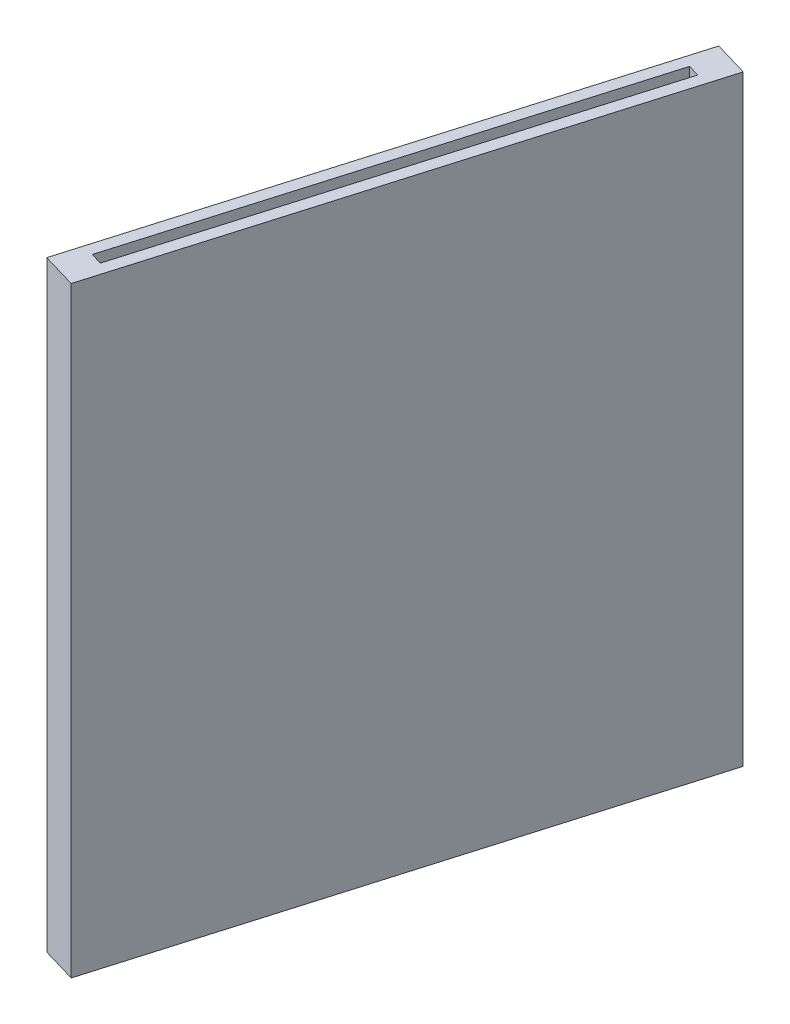
ISO-10303-21;
HEADER;
FILE_DESCRIPTION(('STEP AP214'),'2;1');
FILE_NAME('part.step','',(''),(''),'','','');
FILE_SCHEMA(('AUTOMOTIVE_DESIGN { 1 0 10303 214 1 1 1 1 }'));
ENDSEC;
DATA;
#1=APPLICATION_CONTEXT('core data for automotive mechanical design processes');
#2=APPLICATION_PROTOCOL_DEFINITION('international standard','automotive_design',2000,#1);
#3=PRODUCT_CONTEXT('',#1,'mechanical');
#4=PRODUCT('Part','Part','',(#3));
#5=PRODUCT_RELATED_PRODUCT_CATEGORY('part','',(#4));
#6=PRODUCT_DEFINITION_FORMATION('','',#4);
#7=PRODUCT_DEFINITION_CONTEXT('part definition',#1,'design');
#8=PRODUCT_DEFINITION('design','',#6,#7);
#9=PRODUCT_DEFINITION_SHAPE('','',#8);
#10=(LENGTH_UNIT() NAMED_UNIT(*) SI_UNIT(.MILLI.,.METRE.));
#11=(NAMED_UNIT(*) PLANE_ANGLE_UNIT() SI_UNIT($,.RADIAN.));
#12=(NAMED_UNIT(*) SI_UNIT($,.STERADIAN.) SOLID_ANGLE_UNIT());
#13=UNCERTAINTY_MEASURE_WITH_UNIT(LENGTH_MEASURE(1.E-05),#10,'distance_accuracy_value','');
#14=(GEOMETRIC_REPRESENTATION_CONTEXT(3) GLOBAL_UNCERTAINTY_ASSIGNED_CONTEXT((#13)) GLOBAL_UNIT_ASSIGNED_CONTEXT((#10,
#11,#12)) REPRESENTATION_CONTEXT('',''));
#15=CARTESIAN_POINT('',(0.,0.,0.));
#16=DIRECTION('',(0.,0.,1.));
#17=DIRECTION('',(1.,0.,0.));
#18=AXIS2_PLACEMENT_3D('',#15,#16,#17);
#19=CARTESIAN_POINT('',(-3.6551825609865,-127.,-1.07505369440774));
#20=DIRECTION('',(-0.959365501571275,0.,-0.282166323991537));
#21=DIRECTION('',(-0.282166323991537,0.,0.959365501571275));
#22=AXIS2_PLACEMENT_3D('',#19,#20,#21);
#23=PLANE('',#22);
#24=DIRECTION('',(-0.282166323991537,0.,0.959365501571275));
#25=VECTOR('',#24,1.);
#26=CARTESIAN_POINT('',(-3.6551825609865,0.,-1.07505369440774));
#27=LINE('',#26,#25);
#28=CARTESIAN_POINT('',(-3.6551825609865,0.,-1.07505369440774));
#29=VERTEX_POINT('',#28);
#30=CARTESIAN_POINT('',(-35.9067933932191,0.,108.580423135189));
#31=VERTEX_POINT('',#30);
#32=EDGE_CURVE('E154',#29,#31,#27,.T.);
#33=ORIENTED_EDGE('',*,*,#32,.F.);
#34=DIRECTION('',(0.,1.,0.));
#35=VECTOR('',#34,1.);
#36=CARTESIAN_POINT('',(-3.6551825609865,-127.,-1.07505369440774));
#37=LINE('',#36,#35);
#38=CARTESIAN_POINT('',(-3.6551825609865,-127.,-1.07505369440774));
#39=VERTEX_POINT('',#38);
#40=EDGE_CURVE('E11',#39,#29,#37,.T.);
#41=ORIENTED_EDGE('',*,*,#40,.F.);
#42=DIRECTION('',(-0.282166323991537,0.,0.959365501571275));
#43=VECTOR('',#42,1.);
#44=CARTESIAN_POINT('',(-3.6551825609865,-127.,-1.07505369440774));
#45=LINE('',#44,#43);
#46=CARTESIAN_POINT('',(-35.9067933932191,-127.,108.580423135189));
#47=VERTEX_POINT('',#46);
#48=EDGE_CURVE('E160',#39,#47,#45,.T.);
#49=ORIENTED_EDGE('',*,*,#48,.T.);
#50=DIRECTION('',(0.,1.,0.));
#51=VECTOR('',#50,1.);
#52=CARTESIAN_POINT('',(-35.9067933932191,-127.,108.580423135189));
#53=LINE('',#52,#51);
#54=EDGE_CURVE('E48',#47,#31,#53,.T.);
#55=ORIENTED_EDGE('',*,*,#54,.T.);
#56=EDGE_LOOP('',(#33,#41,#49,#55));
#57=FACE_BOUND('',#56,.T.);
#58=ADVANCED_FACE('F45',(#57),#23,.T.);
#59=CARTESIAN_POINT('',(3.6551825609865,-127.,1.07505369440774));
#60=DIRECTION('',(0.282166323991536,0.,-0.959365501571275));
#61=DIRECTION('',(-0.959365501571275,0.,-0.282166323991536));
#62=AXIS2_PLACEMENT_3D('',#59,#60,#61);
#63=PLANE('',#62);
#64=DIRECTION('',(-0.959365501571275,0.,-0.282166323991536));
#65=VECTOR('',#64,1.);
#66=CARTESIAN_POINT('',(3.6551825609865,0.,1.07505369440774));
#67=LINE('',#66,#65);
#68=CARTESIAN_POINT('',(3.6551825609865,0.,1.07505369440774));
#69=VERTEX_POINT('',#68);
#70=EDGE_CURVE('E165',#69,#29,#67,.T.);
#71=ORIENTED_EDGE('',*,*,#70,.F.);
#72=DIRECTION('',(0.,1.,0.));
#73=VECTOR('',#72,1.);
#74=CARTESIAN_POINT('',(3.6551825609865,-127.,1.07505369440774));
#75=LINE('',#74,#73);
#76=CARTESIAN_POINT('',(3.6551825609865,-127.,1.07505369440774));
#77=VERTEX_POINT('',#76);
#78=EDGE_CURVE('E54',#77,#69,#75,.T.);
#79=ORIENTED_EDGE('',*,*,#78,.F.);
#80=DIRECTION('',(-0.959365501571275,0.,-0.282166323991536));
#81=VECTOR('',#80,1.);
#82=CARTESIAN_POINT('',(3.6551825609865,-127.,1.07505369440774));
#83=LINE('',#82,#81);
#84=EDGE_CURVE('E173',#77,#39,#83,.T.);
#85=ORIENTED_EDGE('',*,*,#84,.T.);
#86=ORIENTED_EDGE('',*,*,#40,.T.);
#87=EDGE_LOOP('',(#71,#79,#85,#86));
#88=FACE_BOUND('',#87,.T.);
#89=ADVANCED_FACE('F207',(#88),#63,.T.);
#90=CARTESIAN_POINT('',(-28.596428271246,-127.,110.730530524004));
#91=DIRECTION('',(0.959365501571275,0.,0.282166323991535));
#92=DIRECTION('',(0.282166323991535,0.,-0.959365501571275));
#93=AXIS2_PLACEMENT_3D('',#90,#91,#92);
#94=PLANE('',#93);
#95=DIRECTION('',(0.282166323991535,0.,-0.959365501571275));
#96=VECTOR('',#95,1.);
#97=CARTESIAN_POINT('',(-28.596428271246,0.,110.730530524004));
#98=LINE('',#97,#96);
#99=CARTESIAN_POINT('',(-28.596428271246,0.,110.730530524004));
#100=VERTEX_POINT('',#99);
#101=EDGE_CURVE('E184',#100,#69,#98,.T.);
#102=ORIENTED_EDGE('',*,*,#101,.F.);
#103=DIRECTION('',(0.,1.,0.));
#104=VECTOR('',#103,1.);
#105=CARTESIAN_POINT('',(-28.596428271246,-127.,110.730530524004));
#106=LINE('',#105,#104);
#107=CARTESIAN_POINT('',(-28.596428271246,-127.,110.730530524004));
#108=VERTEX_POINT('',#107);
#109=EDGE_CURVE('E192',#108,#100,#106,.T.);
#110=ORIENTED_EDGE('',*,*,#109,.F.);
#111=DIRECTION('',(0.282166323991535,0.,-0.959365501571275));
#112=VECTOR('',#111,1.);
#113=CARTESIAN_POINT('',(-28.596428271246,-127.,110.730530524004));
#114=LINE('',#113,#112);
#115=EDGE_CURVE('E169',#108,#77,#114,.T.);
#116=ORIENTED_EDGE('',*,*,#115,.T.);
#117=ORIENTED_EDGE('',*,*,#78,.T.);
#118=EDGE_LOOP('',(#102,#110,#116,#117));
#119=FACE_BOUND('',#118,.T.);
#120=ADVANCED_FACE('F211',(#119),#94,.T.);
#121=CARTESIAN_POINT('',(-35.9067933932191,-127.,108.580423135189));
#122=DIRECTION('',(-0.282166323991537,0.,0.959365501571275));
#123=DIRECTION('',(0.959365501571275,0.,0.282166323991537));
#124=AXIS2_PLACEMENT_3D('',#121,#122,#123);
#125=PLANE('',#124);
#126=DIRECTION('',(0.959365501571275,0.,0.282166323991537));
#127=VECTOR('',#126,1.);
#128=CARTESIAN_POINT('',(-35.9067933932191,0.,108.580423135189));
#129=LINE('',#128,#127);
#130=EDGE_CURVE('E180',#31,#100,#129,.T.);
#131=ORIENTED_EDGE('',*,*,#130,.F.);
#132=ORIENTED_EDGE('',*,*,#54,.F.);
#133=DIRECTION('',(0.959365501571275,0.,0.282166323991537));
#134=VECTOR('',#133,1.);
#135=CARTESIAN_POINT('',(-35.9067933932191,-127.,108.580423135189));
#136=LINE('',#135,#134);
#137=EDGE_CURVE('E164',#47,#108,#136,.T.);
#138=ORIENTED_EDGE('',*,*,#137,.T.);
#139=ORIENTED_EDGE('',*,*,#109,.T.);
#140=EDGE_LOOP('',(#131,#132,#138,#139));
#141=FACE_BOUND('',#140,.T.);
#142=ADVANCED_FACE('F202',(#141),#125,.T.);
#143=CARTESIAN_POINT('',(0.,-127.,0.));
#144=DIRECTION('',(0.,1.,0.));
#145=DIRECTION('',(0.,0.,1.));
#146=AXIS2_PLACEMENT_3D('',#143,#144,#145);
#147=PLANE('',#146);
#148=DIRECTION('',(-0.959365501571273,0.,-0.282166323991542));
#149=VECTOR('',#148,1.);
#150=CARTESIAN_POINT('',(-3.01015034434046,-127.,5.73361970350872));
#151=LINE('',#150,#149);
#152=CARTESIAN_POINT('',(-0.573361970349599,-127.,6.45032216644719));
#153=VERTEX_POINT('',#152);
#154=CARTESIAN_POINT('',(-3.01015034434046,-127.,5.73361970350872));
#155=VERTEX_POINT('',#154);
#156=EDGE_CURVE('E120',#153,#155,#151,.T.);
#157=ORIENTED_EDGE('',*,*,#156,.T.);
#158=DIRECTION('',(-0.282166323991535,0.,0.959365501571275));
#159=VECTOR('',#158,1.);
#160=CARTESIAN_POINT('',(-31.6782488618804,-127.,103.20515466315));
#161=LINE('',#160,#159);
#162=CARTESIAN_POINT('',(-31.6782488618804,-127.,103.20515466315));
#163=VERTEX_POINT('',#162);
#164=EDGE_CURVE('E113',#155,#163,#161,.T.);
#165=ORIENTED_EDGE('',*,*,#164,.T.);
#166=DIRECTION('',(0.959365501571273,0.,0.282166323991543));
#167=VECTOR('',#166,1.);
#168=CARTESIAN_POINT('',(-29.2414604878896,-127.,103.921857126089));
#169=LINE('',#168,#167);
#170=CARTESIAN_POINT('',(-29.2414604878896,-127.,103.921857126089));
#171=VERTEX_POINT('',#170);
#172=EDGE_CURVE('E123',#163,#171,#169,.T.);
#173=ORIENTED_EDGE('',*,*,#172,.T.);
#174=DIRECTION('',(0.282166323991535,0.,-0.959365501571275));
#175=VECTOR('',#174,1.);
#176=CARTESIAN_POINT('',(-0.573361970349599,-127.,6.45032216644719));
#177=LINE('',#176,#175);
#178=EDGE_CURVE('E62',#171,#153,#177,.T.);
#179=ORIENTED_EDGE('',*,*,#178,.T.);
#180=EDGE_LOOP('',(#157,#165,#173,#179));
#181=FACE_BOUND('',#180,.T.);
#182=ORIENTED_EDGE('',*,*,#48,.F.);
#183=ORIENTED_EDGE('',*,*,#84,.F.);
#184=ORIENTED_EDGE('',*,*,#115,.F.);
#185=ORIENTED_EDGE('',*,*,#137,.F.);
#186=EDGE_LOOP('',(#182,#183,#184,#185));
#187=FACE_BOUND('',#186,.T.);
#188=ADVANCED_FACE('F128',(#181,#187),#147,.F.);
#189=CARTESIAN_POINT('',(0.,0.,0.));
#190=DIRECTION('',(0.,1.,0.));
#191=DIRECTION('',(0.,0.,1.));
#192=AXIS2_PLACEMENT_3D('',#189,#190,#191);
#193=PLANE('',#192);
#194=DIRECTION('',(-0.282166323991535,0.,0.959365501571275));
#195=VECTOR('',#194,1.);
#196=CARTESIAN_POINT('',(-31.6782488618804,0.,103.20515466315));
#197=LINE('',#196,#195);
#198=CARTESIAN_POINT('',(-3.01015034434046,0.,5.73361970350872));
#199=VERTEX_POINT('',#198);
#200=CARTESIAN_POINT('',(-31.6782488618804,0.,103.20515466315));
#201=VERTEX_POINT('',#200);
#202=EDGE_CURVE('E70',#199,#201,#197,.T.);
#203=ORIENTED_EDGE('',*,*,#202,.F.);
#204=DIRECTION('',(-0.959365501571273,0.,-0.282166323991542));
#205=VECTOR('',#204,1.);
#206=CARTESIAN_POINT('',(-3.01015034434046,0.,5.73361970350872));
#207=LINE('',#206,#205);
#208=CARTESIAN_POINT('',(-0.573361970349599,0.,6.45032216644719));
#209=VERTEX_POINT('',#208);
#210=EDGE_CURVE('E132',#209,#199,#207,.T.);
#211=ORIENTED_EDGE('',*,*,#210,.F.);
#212=DIRECTION('',(0.282166323991535,0.,-0.959365501571275));
#213=VECTOR('',#212,1.);
#214=CARTESIAN_POINT('',(-0.573361970349599,0.,6.45032216644719));
#215=LINE('',#214,#213);
#216=CARTESIAN_POINT('',(-29.2414604878896,0.,103.921857126089));
#217=VERTEX_POINT('',#216);
#218=EDGE_CURVE('E136',#217,#209,#215,.T.);
#219=ORIENTED_EDGE('',*,*,#218,.F.);
#220=DIRECTION('',(0.959365501571273,0.,0.282166323991543));
#221=VECTOR('',#220,1.);
#222=CARTESIAN_POINT('',(-29.2414604878896,0.,103.921857126089));
#223=LINE('',#222,#221);
#224=EDGE_CURVE('E145',#201,#217,#223,.T.);
#225=ORIENTED_EDGE('',*,*,#224,.F.);
#226=EDGE_LOOP('',(#203,#211,#219,#225));
#227=FACE_BOUND('',#226,.T.);
#228=ORIENTED_EDGE('',*,*,#32,.T.);
#229=ORIENTED_EDGE('',*,*,#130,.T.);
#230=ORIENTED_EDGE('',*,*,#101,.T.);
#231=ORIENTED_EDGE('',*,*,#70,.T.);
#232=EDGE_LOOP('',(#228,#229,#230,#231));
#233=FACE_BOUND('',#232,.T.);
#234=ADVANCED_FACE('F204',(#227,#233),#193,.T.);
#235=CARTESIAN_POINT('',(-31.6782488618804,-127.,103.20515466315));
#236=DIRECTION('',(-0.959365501571275,0.,-0.282166323991535));
#237=DIRECTION('',(-0.282166323991535,0.,0.959365501571275));
#238=AXIS2_PLACEMENT_3D('',#235,#236,#237);
#239=PLANE('',#238);
#240=ORIENTED_EDGE('',*,*,#202,.T.);
#241=DIRECTION('',(0.,1.,0.));
#242=VECTOR('',#241,1.);
#243=CARTESIAN_POINT('',(-31.6782488618804,-127.,103.20515466315));
#244=LINE('',#243,#242);
#245=EDGE_CURVE('E109',#163,#201,#244,.T.);
#246=ORIENTED_EDGE('',*,*,#245,.F.);
#247=ORIENTED_EDGE('',*,*,#164,.F.);
#248=DIRECTION('',(0.,1.,0.));
#249=VECTOR('',#248,1.);
#250=CARTESIAN_POINT('',(-3.01015034434046,-127.,5.73361970350872));
#251=LINE('',#250,#249);
#252=EDGE_CURVE('E151',#155,#199,#251,.T.);
#253=ORIENTED_EDGE('',*,*,#252,.T.);
#254=EDGE_LOOP('',(#240,#246,#247,#253));
#255=FACE_BOUND('',#254,.T.);
#256=ADVANCED_FACE('F111',(#255),#239,.F.);
#257=CARTESIAN_POINT('',(-3.01015034434046,-127.,5.73361970350872));
#258=DIRECTION('',(0.282166323991542,0.,-0.959365501571273));
#259=DIRECTION('',(-0.959365501571273,0.,-0.282166323991542));
#260=AXIS2_PLACEMENT_3D('',#257,#258,#259);
#261=PLANE('',#260);
#262=ORIENTED_EDGE('',*,*,#210,.T.);
#263=ORIENTED_EDGE('',*,*,#252,.F.);
#264=ORIENTED_EDGE('',*,*,#156,.F.);
#265=DIRECTION('',(0.,1.,0.));
#266=VECTOR('',#265,1.);
#267=CARTESIAN_POINT('',(-0.573361970349599,-127.,6.45032216644719));
#268=LINE('',#267,#266);
#269=EDGE_CURVE('E155',#153,#209,#268,.T.);
#270=ORIENTED_EDGE('',*,*,#269,.T.);
#271=EDGE_LOOP('',(#262,#263,#264,#270));
#272=FACE_BOUND('',#271,.T.);
#273=ADVANCED_FACE('F264',(#272),#261,.F.);
#274=CARTESIAN_POINT('',(-0.573361970349599,-127.,6.45032216644719));
#275=DIRECTION('',(0.959365501571275,0.,0.282166323991535));
#276=DIRECTION('',(0.282166323991535,0.,-0.959365501571275));
#277=AXIS2_PLACEMENT_3D('',#274,#275,#276);
#278=PLANE('',#277);
#279=ORIENTED_EDGE('',*,*,#218,.T.);
#280=ORIENTED_EDGE('',*,*,#269,.F.);
#281=ORIENTED_EDGE('',*,*,#178,.F.);
#282=DIRECTION('',(0.,1.,0.));
#283=VECTOR('',#282,1.);
#284=CARTESIAN_POINT('',(-29.2414604878896,-127.,103.921857126089));
#285=LINE('',#284,#283);
#286=EDGE_CURVE('E119',#171,#217,#285,.T.);
#287=ORIENTED_EDGE('',*,*,#286,.T.);
#288=EDGE_LOOP('',(#279,#280,#281,#287));
#289=FACE_BOUND('',#288,.T.);
#290=ADVANCED_FACE('F273',(#289),#278,.F.);
#291=CARTESIAN_POINT('',(-29.2414604878896,-127.,103.921857126089));
#292=DIRECTION('',(-0.282166323991543,0.,0.959365501571273));
#293=DIRECTION('',(0.959365501571273,0.,0.282166323991543));
#294=AXIS2_PLACEMENT_3D('',#291,#292,#293);
#295=PLANE('',#294);
#296=ORIENTED_EDGE('',*,*,#224,.T.);
#297=ORIENTED_EDGE('',*,*,#286,.F.);
#298=ORIENTED_EDGE('',*,*,#172,.F.);
#299=ORIENTED_EDGE('',*,*,#245,.T.);
#300=EDGE_LOOP('',(#296,#297,#298,#299));
#301=FACE_BOUND('',#300,.T.);
#302=ADVANCED_FACE('F124',(#301),#295,.F.);
#303=CLOSED_SHELL('',(#58,#89,#120,#142,#188,#234,#256,#273,#290,#302));
#304=MANIFOLD_SOLID_BREP('B2',#303);
#305=ADVANCED_BREP_SHAPE_REPRESENTATION('',(#18,#304),#14);
#306=SHAPE_DEFINITION_REPRESENTATION(#9,#305);
ENDSEC;
END-ISO-10303-21;
